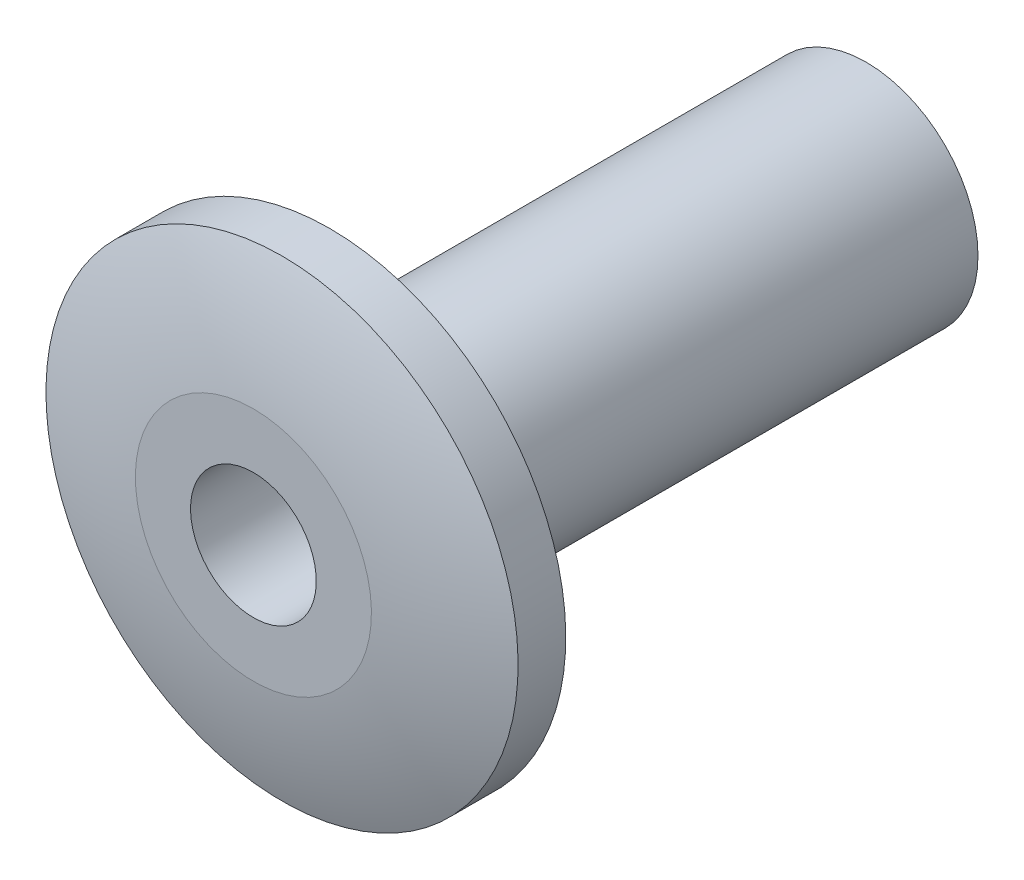
ISO-10303-21;
HEADER;
FILE_DESCRIPTION(('STEP AP214'),'2;1');
FILE_NAME('part.step','',(''),(''),'','','');
FILE_SCHEMA(('AUTOMOTIVE_DESIGN { 1 0 10303 214 1 1 1 1 }'));
ENDSEC;
DATA;
#1=APPLICATION_CONTEXT('core data for automotive mechanical design processes');
#2=APPLICATION_PROTOCOL_DEFINITION('international standard','automotive_design',2000,#1);
#3=PRODUCT_CONTEXT('',#1,'mechanical');
#4=PRODUCT('Part','Part','',(#3));
#5=PRODUCT_RELATED_PRODUCT_CATEGORY('part','',(#4));
#6=PRODUCT_DEFINITION_FORMATION('','',#4);
#7=PRODUCT_DEFINITION_CONTEXT('part definition',#1,'design');
#8=PRODUCT_DEFINITION('design','',#6,#7);
#9=PRODUCT_DEFINITION_SHAPE('','',#8);
#10=(LENGTH_UNIT() NAMED_UNIT(*) SI_UNIT(.MILLI.,.METRE.));
#11=(NAMED_UNIT(*) PLANE_ANGLE_UNIT() SI_UNIT($,.RADIAN.));
#12=(NAMED_UNIT(*) SI_UNIT($,.STERADIAN.) SOLID_ANGLE_UNIT());
#13=UNCERTAINTY_MEASURE_WITH_UNIT(LENGTH_MEASURE(1.E-05),#10,'distance_accuracy_value','');
#14=(GEOMETRIC_REPRESENTATION_CONTEXT(3) GLOBAL_UNCERTAINTY_ASSIGNED_CONTEXT((#13)) GLOBAL_UNIT_ASSIGNED_CONTEXT((#10,
#11,#12)) REPRESENTATION_CONTEXT('',''));
#15=CARTESIAN_POINT('',(0.,0.,0.));
#16=DIRECTION('',(0.,0.,1.));
#17=DIRECTION('',(1.,0.,0.));
#18=AXIS2_PLACEMENT_3D('',#15,#16,#17);
#19=CARTESIAN_POINT('',(0.,0.,-5.715));
#20=DIRECTION('',(0.,0.,-1.));
#21=DIRECTION('',(0.,1.,0.));
#22=AXIS2_PLACEMENT_3D('',#19,#20,#21);
#23=CYLINDRICAL_SURFACE('',#22,2.5146);
#24=CARTESIAN_POINT('',(0.,0.,0.507999999999999));
#25=DIRECTION('',(0.,0.,-1.));
#26=DIRECTION('',(0.,1.,0.));
#27=AXIS2_PLACEMENT_3D('',#24,#25,#26);
#28=CIRCLE('',#27,2.5146);
#29=CARTESIAN_POINT('',(0.,2.5146,0.507999999999999));
#30=VERTEX_POINT('',#29);
#31=EDGE_CURVE('E10',#30,#30,#28,.T.);
#32=ORIENTED_EDGE('',*,*,#31,.T.);
#33=EDGE_LOOP('',(#32));
#34=FACE_BOUND('',#33,.T.);
#35=CARTESIAN_POINT('',(0.,0.,0.));
#36=DIRECTION('',(0.,0.,-1.));
#37=DIRECTION('',(0.,1.,0.));
#38=AXIS2_PLACEMENT_3D('',#35,#36,#37);
#39=CIRCLE('',#38,2.5146);
#40=CARTESIAN_POINT('',(0.,2.5146,0.));
#41=VERTEX_POINT('',#40);
#42=EDGE_CURVE('E58',#41,#41,#39,.T.);
#43=ORIENTED_EDGE('',*,*,#42,.F.);
#44=EDGE_LOOP('',(#43));
#45=FACE_BOUND('',#44,.T.);
#46=ADVANCED_FACE('F33',(#34,#45),#23,.T.);
#47=CARTESIAN_POINT('',(0.,0.,-4.66347968749998));
#48=DIRECTION('',(0.,0.,-1.));
#49=DIRECTION('',(0.,1.,0.));
#50=AXIS2_PLACEMENT_3D('',#47,#48,#49);
#51=DEGENERATE_TOROIDAL_SURFACE('',#50,0.5953125,5.51614599751322,.T.);
#52=CARTESIAN_POINT('',(0.,0.,0.812800000000001));
#53=DIRECTION('',(0.,0.,-1.));
#54=DIRECTION('',(0.,1.,0.));
#55=AXIS2_PLACEMENT_3D('',#52,#53,#54);
#56=CIRCLE('',#55,1.2573);
#57=CARTESIAN_POINT('',(0.,1.2573,0.812800000000001));
#58=VERTEX_POINT('',#57);
#59=EDGE_CURVE('E39',#58,#58,#56,.T.);
#60=ORIENTED_EDGE('',*,*,#59,.T.);
#61=EDGE_LOOP('',(#60));
#62=FACE_BOUND('',#61,.T.);
#63=ORIENTED_EDGE('',*,*,#31,.F.);
#64=EDGE_LOOP('',(#63));
#65=FACE_BOUND('',#64,.T.);
#66=ADVANCED_FACE('F66',(#62,#65),#51,.T.);
#67=CARTESIAN_POINT('',(0.,0.6697265625,0.8128));
#68=DIRECTION('',(0.,0.,1.));
#69=DIRECTION('',(0.,-1.,0.));
#70=AXIS2_PLACEMENT_3D('',#67,#68,#69);
#71=PLANE('',#70);
#72=CARTESIAN_POINT('',(0.,0.,0.8128));
#73=DIRECTION('',(0.,0.,-1.));
#74=DIRECTION('',(0.,1.,0.));
#75=AXIS2_PLACEMENT_3D('',#72,#73,#74);
#76=CIRCLE('',#75,0.669726562500001);
#77=CARTESIAN_POINT('',(0.,0.6697265625,0.8128));
#78=VERTEX_POINT('',#77);
#79=EDGE_CURVE('E43',#78,#78,#76,.T.);
#80=ORIENTED_EDGE('',*,*,#79,.T.);
#81=EDGE_LOOP('',(#80));
#82=FACE_BOUND('',#81,.T.);
#83=ORIENTED_EDGE('',*,*,#59,.F.);
#84=EDGE_LOOP('',(#83));
#85=FACE_BOUND('',#84,.T.);
#86=ADVANCED_FACE('F70',(#82,#85),#71,.T.);
#87=CARTESIAN_POINT('',(0.,0.,-5.715));
#88=DIRECTION('',(0.,0.,-1.));
#89=DIRECTION('',(0.,1.,0.));
#90=AXIS2_PLACEMENT_3D('',#87,#88,#89);
#91=CYLINDRICAL_SURFACE('',#90,0.669726562500001);
#92=CARTESIAN_POINT('',(0.,0.,-0.571500000000001));
#93=DIRECTION('',(0.,0.,-1.));
#94=DIRECTION('',(0.,1.,0.));
#95=AXIS2_PLACEMENT_3D('',#92,#93,#94);
#96=CIRCLE('',#95,0.669726562500001);
#97=CARTESIAN_POINT('',(0.,0.6697265625,-0.571500000000001));
#98=VERTEX_POINT('',#97);
#99=EDGE_CURVE('E47',#98,#98,#96,.T.);
#100=ORIENTED_EDGE('',*,*,#99,.T.);
#101=EDGE_LOOP('',(#100));
#102=FACE_BOUND('',#101,.T.);
#103=ORIENTED_EDGE('',*,*,#79,.F.);
#104=EDGE_LOOP('',(#103));
#105=FACE_BOUND('',#104,.T.);
#106=ADVANCED_FACE('F74',(#102,#105),#91,.F.);
#107=CARTESIAN_POINT('',(0.,0.6697265625,-0.571500000000001));
#108=DIRECTION('',(0.,0.,1.));
#109=DIRECTION('',(0.,-1.,0.));
#110=AXIS2_PLACEMENT_3D('',#107,#108,#109);
#111=PLANE('',#110);
#112=ORIENTED_EDGE('',*,*,#99,.F.);
#113=EDGE_LOOP('',(#112));
#114=FACE_BOUND('',#113,.T.);
#115=ADVANCED_FACE('F81',(#114),#111,.T.);
#116=CARTESIAN_POINT('',(0.,1.190625,-5.715));
#117=DIRECTION('',(0.,0.,-1.));
#118=DIRECTION('',(0.,1.,0.));
#119=AXIS2_PLACEMENT_3D('',#116,#117,#118);
#120=PLANE('',#119);
#121=CARTESIAN_POINT('',(0.,0.,-5.715));
#122=DIRECTION('',(0.,0.,-1.));
#123=DIRECTION('',(0.,1.,0.));
#124=AXIS2_PLACEMENT_3D('',#121,#122,#123);
#125=CIRCLE('',#124,1.190625);
#126=CARTESIAN_POINT('',(0.,1.190625,-5.715));
#127=VERTEX_POINT('',#126);
#128=EDGE_CURVE('E52',#127,#127,#125,.T.);
#129=ORIENTED_EDGE('',*,*,#128,.T.);
#130=EDGE_LOOP('',(#129));
#131=FACE_BOUND('',#130,.T.);
#132=ADVANCED_FACE('F85',(#131),#120,.T.);
#133=CARTESIAN_POINT('',(0.,0.,-5.715));
#134=DIRECTION('',(0.,0.,-1.));
#135=DIRECTION('',(0.,1.,0.));
#136=AXIS2_PLACEMENT_3D('',#133,#134,#135);
#137=CYLINDRICAL_SURFACE('',#136,1.190625);
#138=CARTESIAN_POINT('',(0.,0.,0.));
#139=DIRECTION('',(0.,0.,-1.));
#140=DIRECTION('',(0.,1.,0.));
#141=AXIS2_PLACEMENT_3D('',#138,#139,#140);
#142=CIRCLE('',#141,1.190625);
#143=CARTESIAN_POINT('',(0.,1.190625,0.));
#144=VERTEX_POINT('',#143);
#145=EDGE_CURVE('E55',#144,#144,#142,.T.);
#146=ORIENTED_EDGE('',*,*,#145,.T.);
#147=EDGE_LOOP('',(#146));
#148=FACE_BOUND('',#147,.T.);
#149=ORIENTED_EDGE('',*,*,#128,.F.);
#150=EDGE_LOOP('',(#149));
#151=FACE_BOUND('',#150,.T.);
#152=ADVANCED_FACE('F89',(#148,#151),#137,.T.);
#153=CARTESIAN_POINT('',(0.,1.190625,0.));
#154=DIRECTION('',(0.,0.,-1.));
#155=DIRECTION('',(0.,1.,0.));
#156=AXIS2_PLACEMENT_3D('',#153,#154,#155);
#157=PLANE('',#156);
#158=ORIENTED_EDGE('',*,*,#42,.T.);
#159=EDGE_LOOP('',(#158));
#160=FACE_BOUND('',#159,.T.);
#161=ORIENTED_EDGE('',*,*,#145,.F.);
#162=EDGE_LOOP('',(#161));
#163=FACE_BOUND('',#162,.T.);
#164=ADVANCED_FACE('F62',(#160,#163),#157,.T.);
#165=CLOSED_SHELL('',(#46,#66,#86,#106,#115,#132,#152,#164));
#166=MANIFOLD_SOLID_BREP('B2',#165);
#167=ADVANCED_BREP_SHAPE_REPRESENTATION('',(#18,#166),#14);
#168=SHAPE_DEFINITION_REPRESENTATION(#9,#167);
ENDSEC;
END-ISO-10303-21;
